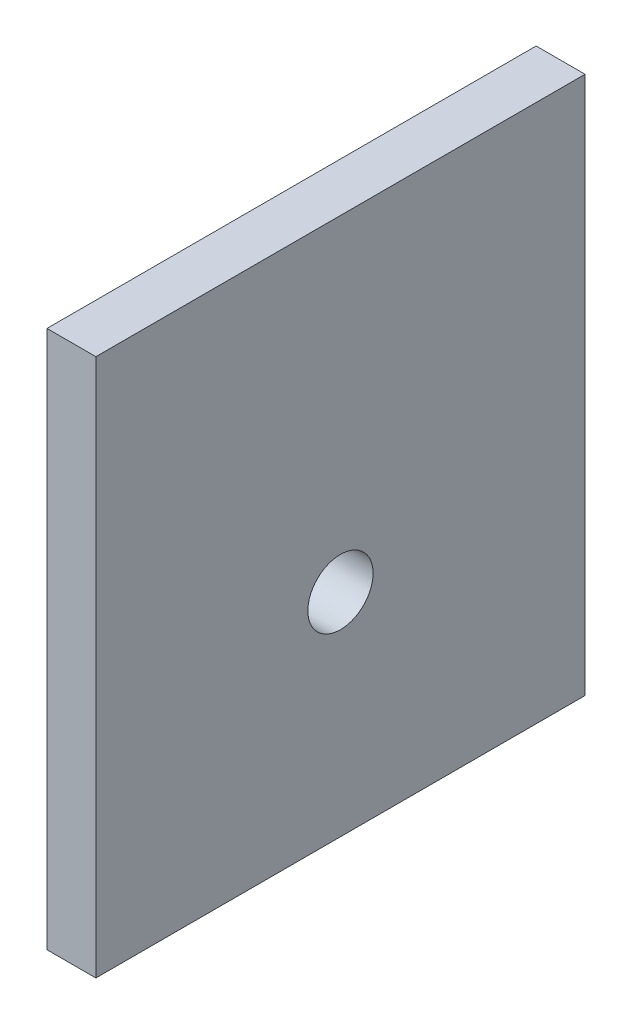
ISO-10303-21;
HEADER;
FILE_DESCRIPTION(('STEP AP214'),'2;1');
FILE_NAME('part.step','',(''),(''),'','','');
FILE_SCHEMA(('AUTOMOTIVE_DESIGN { 1 0 10303 214 1 1 1 1 }'));
ENDSEC;
DATA;
#1=APPLICATION_CONTEXT('core data for automotive mechanical design processes');
#2=APPLICATION_PROTOCOL_DEFINITION('international standard','automotive_design',2000,#1);
#3=PRODUCT_CONTEXT('',#1,'mechanical');
#4=PRODUCT('Part','Part','',(#3));
#5=PRODUCT_RELATED_PRODUCT_CATEGORY('part','',(#4));
#6=PRODUCT_DEFINITION_FORMATION('','',#4);
#7=PRODUCT_DEFINITION_CONTEXT('part definition',#1,'design');
#8=PRODUCT_DEFINITION('design','',#6,#7);
#9=PRODUCT_DEFINITION_SHAPE('','',#8);
#10=(LENGTH_UNIT() NAMED_UNIT(*) SI_UNIT(.MILLI.,.METRE.));
#11=(NAMED_UNIT(*) PLANE_ANGLE_UNIT() SI_UNIT($,.RADIAN.));
#12=(NAMED_UNIT(*) SI_UNIT($,.STERADIAN.) SOLID_ANGLE_UNIT());
#13=UNCERTAINTY_MEASURE_WITH_UNIT(LENGTH_MEASURE(1.E-05),#10,'distance_accuracy_value','');
#14=(GEOMETRIC_REPRESENTATION_CONTEXT(3) GLOBAL_UNCERTAINTY_ASSIGNED_CONTEXT((#13)) GLOBAL_UNIT_ASSIGNED_CONTEXT((#10,
#11,#12)) REPRESENTATION_CONTEXT('',''));
#15=CARTESIAN_POINT('',(0.,0.,0.));
#16=DIRECTION('',(0.,0.,1.));
#17=DIRECTION('',(1.,0.,0.));
#18=AXIS2_PLACEMENT_3D('',#15,#16,#17);
#19=CARTESIAN_POINT('',(3.,-20.,15.));
#20=DIRECTION('',(0.,0.,-1.));
#21=DIRECTION('',(-1.,0.,0.));
#22=AXIS2_PLACEMENT_3D('',#19,#20,#21);
#23=PLANE('',#22);
#24=DIRECTION('',(0.,-1.,0.));
#25=VECTOR('',#24,1.);
#26=CARTESIAN_POINT('',(0.,-20.,15.));
#27=LINE('',#26,#25);
#28=CARTESIAN_POINT('',(0.,20.,15.));
#29=VERTEX_POINT('',#28);
#30=CARTESIAN_POINT('',(0.,-13.,15.));
#31=VERTEX_POINT('',#30);
#32=EDGE_CURVE('E81',#29,#31,#27,.T.);
#33=ORIENTED_EDGE('',*,*,#32,.T.);
#34=DIRECTION('',(-1.,0.,0.));
#35=VECTOR('',#34,1.);
#36=CARTESIAN_POINT('',(3.,-13.,15.));
#37=LINE('',#36,#35);
#38=CARTESIAN_POINT('',(3.,-13.,15.));
#39=VERTEX_POINT('',#38);
#40=EDGE_CURVE('E47',#39,#31,#37,.T.);
#41=ORIENTED_EDGE('',*,*,#40,.F.);
#42=DIRECTION('',(0.,-1.,0.));
#43=VECTOR('',#42,1.);
#44=CARTESIAN_POINT('',(3.,-20.,15.));
#45=LINE('',#44,#43);
#46=CARTESIAN_POINT('',(3.,20.,15.));
#47=VERTEX_POINT('',#46);
#48=EDGE_CURVE('E76',#47,#39,#45,.T.);
#49=ORIENTED_EDGE('',*,*,#48,.F.);
#50=DIRECTION('',(-1.,0.,0.));
#51=VECTOR('',#50,1.);
#52=CARTESIAN_POINT('',(3.,20.,15.));
#53=LINE('',#52,#51);
#54=EDGE_CURVE('E40',#47,#29,#53,.T.);
#55=ORIENTED_EDGE('',*,*,#54,.T.);
#56=EDGE_LOOP('',(#33,#41,#49,#55));
#57=FACE_BOUND('',#56,.T.);
#58=ADVANCED_FACE('F33',(#57),#23,.F.);
#59=CARTESIAN_POINT('',(3.,-20.,-15.));
#60=DIRECTION('',(0.,0.,1.));
#61=DIRECTION('',(1.,0.,0.));
#62=AXIS2_PLACEMENT_3D('',#59,#60,#61);
#63=PLANE('',#62);
#64=DIRECTION('',(0.,1.,0.));
#65=VECTOR('',#64,1.);
#66=CARTESIAN_POINT('',(3.,-20.,-15.));
#67=LINE('',#66,#65);
#68=CARTESIAN_POINT('',(3.,-13.,-15.));
#69=VERTEX_POINT('',#68);
#70=CARTESIAN_POINT('',(3.,20.,-15.));
#71=VERTEX_POINT('',#70);
#72=EDGE_CURVE('E92',#69,#71,#67,.T.);
#73=ORIENTED_EDGE('',*,*,#72,.F.);
#74=DIRECTION('',(-1.,0.,0.));
#75=VECTOR('',#74,1.);
#76=CARTESIAN_POINT('',(3.,-13.,-15.));
#77=LINE('',#76,#75);
#78=CARTESIAN_POINT('',(0.,-13.,-15.));
#79=VERTEX_POINT('',#78);
#80=EDGE_CURVE('E96',#69,#79,#77,.T.);
#81=ORIENTED_EDGE('',*,*,#80,.T.);
#82=DIRECTION('',(0.,1.,0.));
#83=VECTOR('',#82,1.);
#84=CARTESIAN_POINT('',(0.,-20.,-15.));
#85=LINE('',#84,#83);
#86=CARTESIAN_POINT('',(0.,20.,-15.));
#87=VERTEX_POINT('',#86);
#88=EDGE_CURVE('E77',#79,#87,#85,.T.);
#89=ORIENTED_EDGE('',*,*,#88,.T.);
#90=DIRECTION('',(-1.,0.,0.));
#91=VECTOR('',#90,1.);
#92=CARTESIAN_POINT('',(3.,20.,-15.));
#93=LINE('',#92,#91);
#94=EDGE_CURVE('E11',#71,#87,#93,.T.);
#95=ORIENTED_EDGE('',*,*,#94,.F.);
#96=EDGE_LOOP('',(#73,#81,#89,#95));
#97=FACE_BOUND('',#96,.T.);
#98=ADVANCED_FACE('F111',(#97),#63,.F.);
#99=CARTESIAN_POINT('',(3.,20.,-15.));
#100=DIRECTION('',(0.,-1.,0.));
#101=DIRECTION('',(0.,0.,-1.));
#102=AXIS2_PLACEMENT_3D('',#99,#100,#101);
#103=PLANE('',#102);
#104=DIRECTION('',(0.,0.,1.));
#105=VECTOR('',#104,1.);
#106=CARTESIAN_POINT('',(0.,20.,-15.));
#107=LINE('',#106,#105);
#108=EDGE_CURVE('E68',#87,#29,#107,.T.);
#109=ORIENTED_EDGE('',*,*,#108,.T.);
#110=ORIENTED_EDGE('',*,*,#54,.F.);
#111=DIRECTION('',(0.,0.,1.));
#112=VECTOR('',#111,1.);
#113=CARTESIAN_POINT('',(3.,20.,-15.));
#114=LINE('',#113,#112);
#115=EDGE_CURVE('E56',#71,#47,#114,.T.);
#116=ORIENTED_EDGE('',*,*,#115,.F.);
#117=ORIENTED_EDGE('',*,*,#94,.T.);
#118=EDGE_LOOP('',(#109,#110,#116,#117));
#119=FACE_BOUND('',#118,.T.);
#120=ADVANCED_FACE('F70',(#119),#103,.F.);
#121=CARTESIAN_POINT('',(3.,0.,0.));
#122=DIRECTION('',(1.,0.,0.));
#123=DIRECTION('',(0.,0.,-1.));
#124=AXIS2_PLACEMENT_3D('',#121,#122,#123);
#125=PLANE('',#124);
#126=DIRECTION('',(0.,0.,-1.));
#127=VECTOR('',#126,1.);
#128=CARTESIAN_POINT('',(3.,-13.,15.));
#129=LINE('',#128,#127);
#130=EDGE_CURVE('E99',#39,#69,#129,.T.);
#131=ORIENTED_EDGE('',*,*,#130,.T.);
#132=ORIENTED_EDGE('',*,*,#72,.T.);
#133=ORIENTED_EDGE('',*,*,#115,.T.);
#134=ORIENTED_EDGE('',*,*,#48,.T.);
#135=EDGE_LOOP('',(#131,#132,#133,#134));
#136=FACE_BOUND('',#135,.T.);
#137=CARTESIAN_POINT('',(3.,0.,0.));
#138=DIRECTION('',(1.,0.,0.));
#139=DIRECTION('',(0.,0.,-1.));
#140=AXIS2_PLACEMENT_3D('',#137,#138,#139);
#141=CIRCLE('',#140,2.);
#142=CARTESIAN_POINT('',(3.,0.,-2.));
#143=VERTEX_POINT('',#142);
#144=EDGE_CURVE('E88',#143,#143,#141,.T.);
#145=ORIENTED_EDGE('',*,*,#144,.F.);
#146=EDGE_LOOP('',(#145));
#147=FACE_BOUND('',#146,.T.);
#148=ADVANCED_FACE('F105',(#136,#147),#125,.T.);
#149=CARTESIAN_POINT('',(0.,0.,0.));
#150=DIRECTION('',(1.,0.,0.));
#151=DIRECTION('',(0.,0.,-1.));
#152=AXIS2_PLACEMENT_3D('',#149,#150,#151);
#153=PLANE('',#152);
#154=CARTESIAN_POINT('',(0.,0.,0.));
#155=DIRECTION('',(1.,0.,0.));
#156=DIRECTION('',(0.,0.,-1.));
#157=AXIS2_PLACEMENT_3D('',#154,#155,#156);
#158=CIRCLE('',#157,2.);
#159=CARTESIAN_POINT('',(0.,0.,-2.));
#160=VERTEX_POINT('',#159);
#161=EDGE_CURVE('E84',#160,#160,#158,.T.);
#162=ORIENTED_EDGE('',*,*,#161,.T.);
#163=EDGE_LOOP('',(#162));
#164=FACE_BOUND('',#163,.T.);
#165=ORIENTED_EDGE('',*,*,#88,.F.);
#166=DIRECTION('',(0.,0.,-1.));
#167=VECTOR('',#166,1.);
#168=CARTESIAN_POINT('',(0.,-13.,15.));
#169=LINE('',#168,#167);
#170=EDGE_CURVE('E83',#31,#79,#169,.T.);
#171=ORIENTED_EDGE('',*,*,#170,.F.);
#172=ORIENTED_EDGE('',*,*,#32,.F.);
#173=ORIENTED_EDGE('',*,*,#108,.F.);
#174=EDGE_LOOP('',(#165,#171,#172,#173));
#175=FACE_BOUND('',#174,.T.);
#176=ADVANCED_FACE('F82',(#164,#175),#153,.F.);
#177=CARTESIAN_POINT('',(0.,0.,0.));
#178=DIRECTION('',(1.,0.,0.));
#179=DIRECTION('',(0.,0.,-1.));
#180=AXIS2_PLACEMENT_3D('',#177,#178,#179);
#181=CYLINDRICAL_SURFACE('',#180,2.);
#182=ORIENTED_EDGE('',*,*,#161,.F.);
#183=EDGE_LOOP('',(#182));
#184=FACE_BOUND('',#183,.T.);
#185=ORIENTED_EDGE('',*,*,#144,.T.);
#186=EDGE_LOOP('',(#185));
#187=FACE_BOUND('',#186,.T.);
#188=ADVANCED_FACE('F116',(#184,#187),#181,.F.);
#189=CARTESIAN_POINT('',(3.,-13.,15.));
#190=DIRECTION('',(0.,1.,0.));
#191=DIRECTION('',(0.,0.,1.));
#192=AXIS2_PLACEMENT_3D('',#189,#190,#191);
#193=PLANE('',#192);
#194=ORIENTED_EDGE('',*,*,#170,.T.);
#195=ORIENTED_EDGE('',*,*,#80,.F.);
#196=ORIENTED_EDGE('',*,*,#130,.F.);
#197=ORIENTED_EDGE('',*,*,#40,.T.);
#198=EDGE_LOOP('',(#194,#195,#196,#197));
#199=FACE_BOUND('',#198,.T.);
#200=ADVANCED_FACE('F114',(#199),#193,.F.);
#201=CLOSED_SHELL('',(#58,#98,#120,#148,#176,#188,#200));
#202=MANIFOLD_SOLID_BREP('B2',#201);
#203=ADVANCED_BREP_SHAPE_REPRESENTATION('',(#18,#202),#14);
#204=SHAPE_DEFINITION_REPRESENTATION(#9,#203);
ENDSEC;
END-ISO-10303-21;
